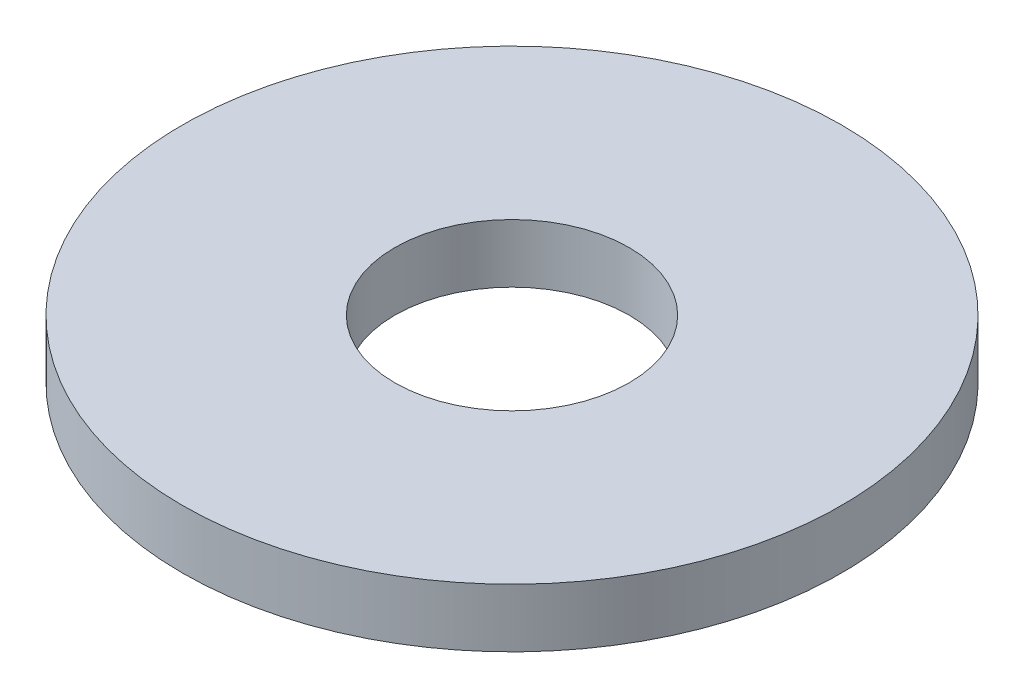
ISO-10303-21;
HEADER;
FILE_DESCRIPTION(('STEP AP214'),'2;1');
FILE_NAME('part.step','',(''),(''),'','','');
FILE_SCHEMA(('AUTOMOTIVE_DESIGN { 1 0 10303 214 1 1 1 1 }'));
ENDSEC;
DATA;
#1=APPLICATION_CONTEXT('core data for automotive mechanical design processes');
#2=APPLICATION_PROTOCOL_DEFINITION('international standard','automotive_design',2000,#1);
#3=PRODUCT_CONTEXT('',#1,'mechanical');
#4=PRODUCT('Part','Part','',(#3));
#5=PRODUCT_RELATED_PRODUCT_CATEGORY('part','',(#4));
#6=PRODUCT_DEFINITION_FORMATION('','',#4);
#7=PRODUCT_DEFINITION_CONTEXT('part definition',#1,'design');
#8=PRODUCT_DEFINITION('design','',#6,#7);
#9=PRODUCT_DEFINITION_SHAPE('','',#8);
#10=(LENGTH_UNIT() NAMED_UNIT(*) SI_UNIT(.MILLI.,.METRE.));
#11=(NAMED_UNIT(*) PLANE_ANGLE_UNIT() SI_UNIT($,.RADIAN.));
#12=(NAMED_UNIT(*) SI_UNIT($,.STERADIAN.) SOLID_ANGLE_UNIT());
#13=UNCERTAINTY_MEASURE_WITH_UNIT(LENGTH_MEASURE(1.E-05),#10,'distance_accuracy_value','');
#14=(GEOMETRIC_REPRESENTATION_CONTEXT(3) GLOBAL_UNCERTAINTY_ASSIGNED_CONTEXT((#13)) GLOBAL_UNIT_ASSIGNED_CONTEXT((#10,
#11,#12)) REPRESENTATION_CONTEXT('',''));
#15=CARTESIAN_POINT('',(0.,0.,0.));
#16=DIRECTION('',(0.,0.,1.));
#17=DIRECTION('',(1.,0.,0.));
#18=AXIS2_PLACEMENT_3D('',#15,#16,#17);
#19=CARTESIAN_POINT('',(0.,0.8,0.));
#20=DIRECTION('',(0.,1.,0.));
#21=DIRECTION('',(0.,0.,1.));
#22=AXIS2_PLACEMENT_3D('',#19,#20,#21);
#23=PLANE('',#22);
#24=CARTESIAN_POINT('',(0.,0.8,0.));
#25=DIRECTION('',(0.,1.,0.));
#26=DIRECTION('',(0.,0.,1.));
#27=AXIS2_PLACEMENT_3D('',#24,#25,#26);
#28=CIRCLE('',#27,4.5);
#29=CARTESIAN_POINT('',(0.,0.8,4.5));
#30=VERTEX_POINT('',#29);
#31=EDGE_CURVE('E10',#30,#30,#28,.T.);
#32=ORIENTED_EDGE('',*,*,#31,.T.);
#33=EDGE_LOOP('',(#32));
#34=FACE_BOUND('',#33,.T.);
#35=CARTESIAN_POINT('',(0.,0.8,0.));
#36=DIRECTION('',(0.,1.,0.));
#37=DIRECTION('',(0.,0.,1.));
#38=AXIS2_PLACEMENT_3D('',#35,#36,#37);
#39=CIRCLE('',#38,1.6);
#40=CARTESIAN_POINT('',(0.,0.8,1.6));
#41=VERTEX_POINT('',#40);
#42=EDGE_CURVE('E41',#41,#41,#39,.T.);
#43=ORIENTED_EDGE('',*,*,#42,.F.);
#44=EDGE_LOOP('',(#43));
#45=FACE_BOUND('',#44,.T.);
#46=ADVANCED_FACE('F30',(#34,#45),#23,.T.);
#47=CARTESIAN_POINT('',(0.,0.,0.));
#48=DIRECTION('',(0.,1.,0.));
#49=DIRECTION('',(0.,0.,1.));
#50=AXIS2_PLACEMENT_3D('',#47,#48,#49);
#51=PLANE('',#50);
#52=CARTESIAN_POINT('',(0.,0.,0.));
#53=DIRECTION('',(0.,1.,0.));
#54=DIRECTION('',(0.,0.,1.));
#55=AXIS2_PLACEMENT_3D('',#52,#53,#54);
#56=CIRCLE('',#55,4.5);
#57=CARTESIAN_POINT('',(0.,0.,4.5));
#58=VERTEX_POINT('',#57);
#59=EDGE_CURVE('E34',#58,#58,#56,.T.);
#60=ORIENTED_EDGE('',*,*,#59,.F.);
#61=EDGE_LOOP('',(#60));
#62=FACE_BOUND('',#61,.T.);
#63=CARTESIAN_POINT('',(0.,0.,0.));
#64=DIRECTION('',(0.,1.,0.));
#65=DIRECTION('',(0.,0.,1.));
#66=AXIS2_PLACEMENT_3D('',#63,#64,#65);
#67=CIRCLE('',#66,1.6);
#68=CARTESIAN_POINT('',(0.,0.,1.6));
#69=VERTEX_POINT('',#68);
#70=EDGE_CURVE('E43',#69,#69,#67,.T.);
#71=ORIENTED_EDGE('',*,*,#70,.T.);
#72=EDGE_LOOP('',(#71));
#73=FACE_BOUND('',#72,.T.);
#74=ADVANCED_FACE('F53',(#62,#73),#51,.F.);
#75=CARTESIAN_POINT('',(0.,0.8,0.));
#76=DIRECTION('',(0.,-1.,0.));
#77=DIRECTION('',(0.,0.,-1.));
#78=AXIS2_PLACEMENT_3D('',#75,#76,#77);
#79=CYLINDRICAL_SURFACE('',#78,4.5);
#80=ORIENTED_EDGE('',*,*,#31,.F.);
#81=EDGE_LOOP('',(#80));
#82=FACE_BOUND('',#81,.T.);
#83=ORIENTED_EDGE('',*,*,#59,.T.);
#84=EDGE_LOOP('',(#83));
#85=FACE_BOUND('',#84,.T.);
#86=ADVANCED_FACE('F32',(#82,#85),#79,.T.);
#87=CARTESIAN_POINT('',(0.,0.8,0.));
#88=DIRECTION('',(0.,-1.,0.));
#89=DIRECTION('',(0.,0.,-1.));
#90=AXIS2_PLACEMENT_3D('',#87,#88,#89);
#91=CYLINDRICAL_SURFACE('',#90,1.6);
#92=ORIENTED_EDGE('',*,*,#42,.T.);
#93=EDGE_LOOP('',(#92));
#94=FACE_BOUND('',#93,.T.);
#95=ORIENTED_EDGE('',*,*,#70,.F.);
#96=EDGE_LOOP('',(#95));
#97=FACE_BOUND('',#96,.T.);
#98=ADVANCED_FACE('F49',(#94,#97),#91,.F.);
#99=CLOSED_SHELL('',(#46,#74,#86,#98));
#100=MANIFOLD_SOLID_BREP('B2',#99);
#101=ADVANCED_BREP_SHAPE_REPRESENTATION('',(#18,#100),#14);
#102=SHAPE_DEFINITION_REPRESENTATION(#9,#101);
ENDSEC;
END-ISO-10303-21;
